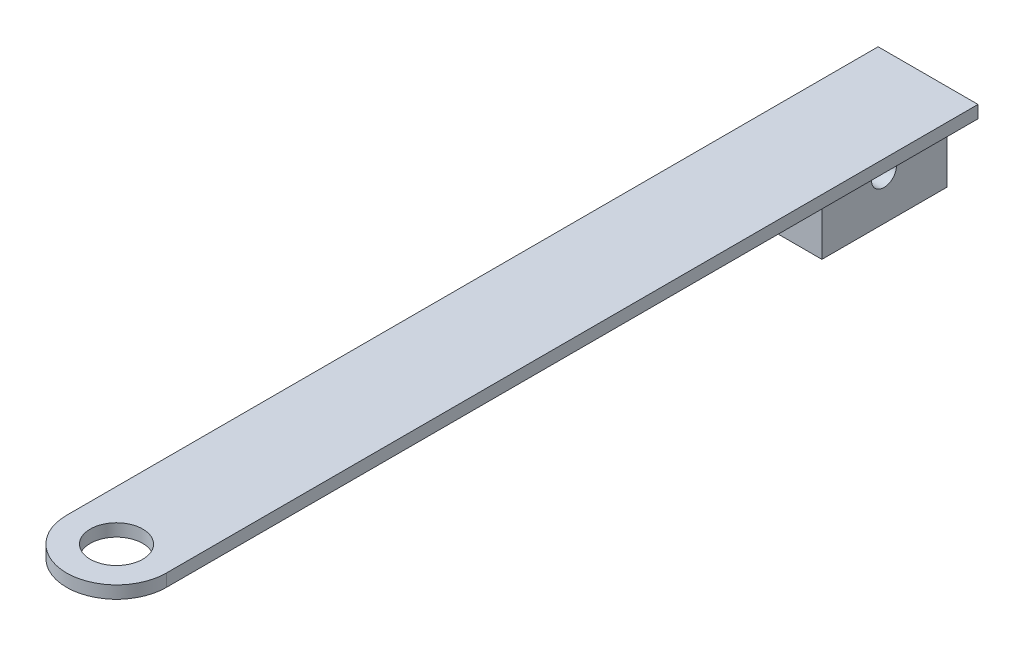
ISO-10303-21;
HEADER;
FILE_DESCRIPTION(('STEP AP214'),'2;1');
FILE_NAME('part.step','',(''),(''),'','','');
FILE_SCHEMA(('AUTOMOTIVE_DESIGN { 1 0 10303 214 1 1 1 1 }'));
ENDSEC;
DATA;
#1=APPLICATION_CONTEXT('core data for automotive mechanical design processes');
#2=APPLICATION_PROTOCOL_DEFINITION('international standard','automotive_design',2000,#1);
#3=PRODUCT_CONTEXT('',#1,'mechanical');
#4=PRODUCT('Part','Part','',(#3));
#5=PRODUCT_RELATED_PRODUCT_CATEGORY('part','',(#4));
#6=PRODUCT_DEFINITION_FORMATION('','',#4);
#7=PRODUCT_DEFINITION_CONTEXT('part definition',#1,'design');
#8=PRODUCT_DEFINITION('design','',#6,#7);
#9=PRODUCT_DEFINITION_SHAPE('','',#8);
#10=(LENGTH_UNIT() NAMED_UNIT(*) SI_UNIT(.MILLI.,.METRE.));
#11=(NAMED_UNIT(*) PLANE_ANGLE_UNIT() SI_UNIT($,.RADIAN.));
#12=(NAMED_UNIT(*) SI_UNIT($,.STERADIAN.) SOLID_ANGLE_UNIT());
#13=UNCERTAINTY_MEASURE_WITH_UNIT(LENGTH_MEASURE(1.E-05),#10,'distance_accuracy_value','');
#14=(GEOMETRIC_REPRESENTATION_CONTEXT(3) GLOBAL_UNCERTAINTY_ASSIGNED_CONTEXT((#13)) GLOBAL_UNIT_ASSIGNED_CONTEXT((#10,
#11,#12)) REPRESENTATION_CONTEXT('',''));
#15=CARTESIAN_POINT('',(0.,0.,0.));
#16=DIRECTION('',(0.,0.,1.));
#17=DIRECTION('',(1.,0.,0.));
#18=AXIS2_PLACEMENT_3D('',#15,#16,#17);
#19=CARTESIAN_POINT('',(0.,0.,0.));
#20=DIRECTION('',(0.,1.,0.));
#21=DIRECTION('',(0.,0.,1.));
#22=AXIS2_PLACEMENT_3D('',#19,#20,#21);
#23=PLANE('',#22);
#24=CARTESIAN_POINT('',(0.,0.,0.));
#25=DIRECTION('',(0.,1.,0.));
#26=DIRECTION('',(0.,0.,1.));
#27=AXIS2_PLACEMENT_3D('',#24,#25,#26);
#28=CIRCLE('',#27,2.667);
#29=CARTESIAN_POINT('',(0.,0.,2.667));
#30=VERTEX_POINT('',#29);
#31=EDGE_CURVE('E159',#30,#30,#28,.T.);
#32=ORIENTED_EDGE('',*,*,#31,.T.);
#33=EDGE_LOOP('',(#32));
#34=FACE_BOUND('',#33,.T.);
#35=DIRECTION('',(-1.,0.,0.));
#36=VECTOR('',#35,1.);
#37=CARTESIAN_POINT('',(-5.07999999999999,0.,-69.85));
#38=LINE('',#37,#36);
#39=CARTESIAN_POINT('',(1.905,0.,-69.85));
#40=VERTEX_POINT('',#39);
#41=CARTESIAN_POINT('',(-5.07999999999999,0.,-69.85));
#42=VERTEX_POINT('',#41);
#43=EDGE_CURVE('E122',#40,#42,#38,.T.);
#44=ORIENTED_EDGE('',*,*,#43,.F.);
#45=DIRECTION('',(0.,0.,1.));
#46=VECTOR('',#45,1.);
#47=CARTESIAN_POINT('',(1.905,0.,-82.55));
#48=LINE('',#47,#46);
#49=CARTESIAN_POINT('',(1.905,0.,-82.55));
#50=VERTEX_POINT('',#49);
#51=EDGE_CURVE('E52',#50,#40,#48,.T.);
#52=ORIENTED_EDGE('',*,*,#51,.F.);
#53=DIRECTION('',(1.,0.,0.));
#54=VECTOR('',#53,1.);
#55=CARTESIAN_POINT('',(5.08,0.,-82.55));
#56=LINE('',#55,#54);
#57=CARTESIAN_POINT('',(5.08,0.,-82.55));
#58=VERTEX_POINT('',#57);
#59=EDGE_CURVE('E142',#50,#58,#56,.T.);
#60=ORIENTED_EDGE('',*,*,#59,.T.);
#61=DIRECTION('',(0.,0.,1.));
#62=VECTOR('',#61,1.);
#63=CARTESIAN_POINT('',(5.08,0.,0.));
#64=LINE('',#63,#62);
#65=CARTESIAN_POINT('',(5.08,0.,0.));
#66=VERTEX_POINT('',#65);
#67=EDGE_CURVE('E139',#58,#66,#64,.T.);
#68=ORIENTED_EDGE('',*,*,#67,.T.);
#69=CARTESIAN_POINT('',(0.,0.,0.));
#70=DIRECTION('',(0.,1.,0.));
#71=DIRECTION('',(0.,0.,1.));
#72=AXIS2_PLACEMENT_3D('',#69,#70,#71);
#73=CIRCLE('',#72,5.08);
#74=CARTESIAN_POINT('',(-5.08,0.,0.));
#75=VERTEX_POINT('',#74);
#76=EDGE_CURVE('E39',#75,#66,#73,.T.);
#77=ORIENTED_EDGE('',*,*,#76,.F.);
#78=DIRECTION('',(0.,0.,-1.));
#79=VECTOR('',#78,1.);
#80=CARTESIAN_POINT('',(-5.07999999999999,0.,-82.55));
#81=LINE('',#80,#79);
#82=EDGE_CURVE('E58',#75,#42,#81,.T.);
#83=ORIENTED_EDGE('',*,*,#82,.T.);
#84=EDGE_LOOP('',(#44,#52,#60,#68,#77,#83));
#85=FACE_BOUND('',#84,.T.);
#86=ADVANCED_FACE('F35',(#34,#85),#23,.F.);
#87=CARTESIAN_POINT('',(0.,1.27,0.));
#88=DIRECTION('',(0.,-1.,0.));
#89=DIRECTION('',(0.,0.,-1.));
#90=AXIS2_PLACEMENT_3D('',#87,#88,#89);
#91=CYLINDRICAL_SURFACE('',#90,2.667);
#92=CARTESIAN_POINT('',(0.,1.27,0.));
#93=DIRECTION('',(0.,1.,0.));
#94=DIRECTION('',(0.,0.,1.));
#95=AXIS2_PLACEMENT_3D('',#92,#93,#94);
#96=CIRCLE('',#95,2.667);
#97=CARTESIAN_POINT('',(0.,1.27,2.667));
#98=VERTEX_POINT('',#97);
#99=EDGE_CURVE('E44',#98,#98,#96,.T.);
#100=ORIENTED_EDGE('',*,*,#99,.T.);
#101=EDGE_LOOP('',(#100));
#102=FACE_BOUND('',#101,.T.);
#103=ORIENTED_EDGE('',*,*,#31,.F.);
#104=EDGE_LOOP('',(#103));
#105=FACE_BOUND('',#104,.T.);
#106=ADVANCED_FACE('F37',(#102,#105),#91,.F.);
#107=CARTESIAN_POINT('',(0.,1.27,0.));
#108=DIRECTION('',(0.,-1.,0.));
#109=DIRECTION('',(0.,0.,-1.));
#110=AXIS2_PLACEMENT_3D('',#107,#108,#109);
#111=CYLINDRICAL_SURFACE('',#110,5.08);
#112=CARTESIAN_POINT('',(0.,1.27,0.));
#113=DIRECTION('',(0.,1.,0.));
#114=DIRECTION('',(0.,0.,1.));
#115=AXIS2_PLACEMENT_3D('',#112,#113,#114);
#116=CIRCLE('',#115,5.08);
#117=CARTESIAN_POINT('',(-5.08,1.27,0.));
#118=VERTEX_POINT('',#117);
#119=CARTESIAN_POINT('',(5.08,1.27,0.));
#120=VERTEX_POINT('',#119);
#121=EDGE_CURVE('E11',#118,#120,#116,.T.);
#122=ORIENTED_EDGE('',*,*,#121,.F.);
#123=DIRECTION('',(0.,-1.,0.));
#124=VECTOR('',#123,1.);
#125=CARTESIAN_POINT('',(-5.08,84.4428807965673,0.));
#126=LINE('',#125,#124);
#127=EDGE_CURVE('E154',#118,#75,#126,.T.);
#128=ORIENTED_EDGE('',*,*,#127,.T.);
#129=ORIENTED_EDGE('',*,*,#76,.T.);
#130=DIRECTION('',(0.,-1.,0.));
#131=VECTOR('',#130,1.);
#132=CARTESIAN_POINT('',(5.08,84.4428807965673,0.));
#133=LINE('',#132,#131);
#134=EDGE_CURVE('E149',#120,#66,#133,.T.);
#135=ORIENTED_EDGE('',*,*,#134,.F.);
#136=EDGE_LOOP('',(#122,#128,#129,#135));
#137=FACE_BOUND('',#136,.T.);
#138=ADVANCED_FACE('F165',(#137),#111,.T.);
#139=CARTESIAN_POINT('',(0.,1.27,0.));
#140=DIRECTION('',(0.,1.,0.));
#141=DIRECTION('',(0.,0.,1.));
#142=AXIS2_PLACEMENT_3D('',#139,#140,#141);
#143=PLANE('',#142);
#144=ORIENTED_EDGE('',*,*,#99,.F.);
#145=EDGE_LOOP('',(#144));
#146=FACE_BOUND('',#145,.T.);
#147=ORIENTED_EDGE('',*,*,#121,.T.);
#148=DIRECTION('',(0.,0.,1.));
#149=VECTOR('',#148,1.);
#150=CARTESIAN_POINT('',(5.08,1.26999999999999,0.));
#151=LINE('',#150,#149);
#152=CARTESIAN_POINT('',(5.08,1.26999999999999,-82.55));
#153=VERTEX_POINT('',#152);
#154=EDGE_CURVE('E146',#153,#120,#151,.T.);
#155=ORIENTED_EDGE('',*,*,#154,.F.);
#156=DIRECTION('',(1.,0.,0.));
#157=VECTOR('',#156,1.);
#158=CARTESIAN_POINT('',(5.08,1.26999999999999,-82.55));
#159=LINE('',#158,#157);
#160=CARTESIAN_POINT('',(-5.07999999999999,1.26999999999999,-82.55));
#161=VERTEX_POINT('',#160);
#162=EDGE_CURVE('E107',#161,#153,#159,.T.);
#163=ORIENTED_EDGE('',*,*,#162,.F.);
#164=DIRECTION('',(0.,0.,-1.));
#165=VECTOR('',#164,1.);
#166=CARTESIAN_POINT('',(-5.07999999999999,1.26999999999999,-82.55));
#167=LINE('',#166,#165);
#168=EDGE_CURVE('E104',#118,#161,#167,.T.);
#169=ORIENTED_EDGE('',*,*,#168,.F.);
#170=EDGE_LOOP('',(#147,#155,#163,#169));
#171=FACE_BOUND('',#170,.T.);
#172=ADVANCED_FACE('F171',(#146,#171),#143,.T.);
#173=CARTESIAN_POINT('',(-5.07999999999999,84.4428807965673,-82.55));
#174=DIRECTION('',(-1.,0.,0.));
#175=DIRECTION('',(0.,0.,1.));
#176=AXIS2_PLACEMENT_3D('',#173,#174,#175);
#177=PLANE('',#176);
#178=CARTESIAN_POINT('',(-5.07999999999999,-3.17500000000001,-76.1576549008699));
#179=DIRECTION('',(-1.,0.,0.));
#180=DIRECTION('',(0.,0.,1.));
#181=AXIS2_PLACEMENT_3D('',#178,#179,#180);
#182=CIRCLE('',#181,1.27);
#183=CARTESIAN_POINT('',(-5.07999999999999,-3.17500000000001,-74.8876549008699));
#184=VERTEX_POINT('',#183);
#185=EDGE_CURVE('E126',#184,#184,#182,.F.);
#186=ORIENTED_EDGE('',*,*,#185,.T.);
#187=EDGE_LOOP('',(#186));
#188=FACE_BOUND('',#187,.T.);
#189=ORIENTED_EDGE('',*,*,#127,.F.);
#190=ORIENTED_EDGE('',*,*,#168,.T.);
#191=DIRECTION('',(0.,-1.,0.));
#192=VECTOR('',#191,1.);
#193=CARTESIAN_POINT('',(-5.07999999999999,84.4428807965673,-82.55));
#194=LINE('',#193,#192);
#195=CARTESIAN_POINT('',(-5.07999999999999,-7.62,-82.55));
#196=VERTEX_POINT('',#195);
#197=EDGE_CURVE('E96',#161,#196,#194,.T.);
#198=ORIENTED_EDGE('',*,*,#197,.T.);
#199=DIRECTION('',(0.,0.,-1.));
#200=VECTOR('',#199,1.);
#201=CARTESIAN_POINT('',(-5.07999999999999,-7.62,-82.55));
#202=LINE('',#201,#200);
#203=CARTESIAN_POINT('',(-5.07999999999999,-7.62,-69.85));
#204=VERTEX_POINT('',#203);
#205=EDGE_CURVE('E102',#204,#196,#202,.T.);
#206=ORIENTED_EDGE('',*,*,#205,.F.);
#207=DIRECTION('',(0.,1.,0.));
#208=VECTOR('',#207,1.);
#209=CARTESIAN_POINT('',(-5.07999999999999,-7.62,-69.85));
#210=LINE('',#209,#208);
#211=EDGE_CURVE('E131',#204,#42,#210,.T.);
#212=ORIENTED_EDGE('',*,*,#211,.T.);
#213=ORIENTED_EDGE('',*,*,#82,.F.);
#214=EDGE_LOOP('',(#189,#190,#198,#206,#212,#213));
#215=FACE_BOUND('',#214,.T.);
#216=ADVANCED_FACE('F99',(#188,#215),#177,.T.);
#217=CARTESIAN_POINT('',(5.08,84.4428807965673,-82.55));
#218=DIRECTION('',(0.,0.,-1.));
#219=DIRECTION('',(-1.,0.,0.));
#220=AXIS2_PLACEMENT_3D('',#217,#218,#219);
#221=PLANE('',#220);
#222=ORIENTED_EDGE('',*,*,#197,.F.);
#223=ORIENTED_EDGE('',*,*,#162,.T.);
#224=DIRECTION('',(0.,-1.,0.));
#225=VECTOR('',#224,1.);
#226=CARTESIAN_POINT('',(5.08,84.4428807965673,-82.55));
#227=LINE('',#226,#225);
#228=EDGE_CURVE('E150',#153,#58,#227,.T.);
#229=ORIENTED_EDGE('',*,*,#228,.T.);
#230=ORIENTED_EDGE('',*,*,#59,.F.);
#231=DIRECTION('',(0.,1.,0.));
#232=VECTOR('',#231,1.);
#233=CARTESIAN_POINT('',(1.905,-7.62,-82.55));
#234=LINE('',#233,#232);
#235=CARTESIAN_POINT('',(1.905,-7.62,-82.55));
#236=VERTEX_POINT('',#235);
#237=EDGE_CURVE('E113',#236,#50,#234,.T.);
#238=ORIENTED_EDGE('',*,*,#237,.F.);
#239=DIRECTION('',(1.,0.,0.));
#240=VECTOR('',#239,1.);
#241=CARTESIAN_POINT('',(-5.07999999999999,-7.62,-82.55));
#242=LINE('',#241,#240);
#243=EDGE_CURVE('E110',#196,#236,#242,.T.);
#244=ORIENTED_EDGE('',*,*,#243,.F.);
#245=EDGE_LOOP('',(#222,#223,#229,#230,#238,#244));
#246=FACE_BOUND('',#245,.T.);
#247=ADVANCED_FACE('F111',(#246),#221,.T.);
#248=CARTESIAN_POINT('',(5.08,84.4428807965673,0.));
#249=DIRECTION('',(1.,0.,0.));
#250=DIRECTION('',(0.,0.,-1.));
#251=AXIS2_PLACEMENT_3D('',#248,#249,#250);
#252=PLANE('',#251);
#253=ORIENTED_EDGE('',*,*,#228,.F.);
#254=ORIENTED_EDGE('',*,*,#154,.T.);
#255=ORIENTED_EDGE('',*,*,#134,.T.);
#256=ORIENTED_EDGE('',*,*,#67,.F.);
#257=EDGE_LOOP('',(#253,#254,#255,#256));
#258=FACE_BOUND('',#257,.T.);
#259=ADVANCED_FACE('F169',(#258),#252,.T.);
#260=CARTESIAN_POINT('',(1.905,-7.62,-82.55));
#261=DIRECTION('',(-1.,0.,0.));
#262=DIRECTION('',(0.,0.,1.));
#263=AXIS2_PLACEMENT_3D('',#260,#261,#262);
#264=PLANE('',#263);
#265=CARTESIAN_POINT('',(1.905,-3.17500000000001,-76.1576549008699));
#266=DIRECTION('',(1.,0.,0.));
#267=DIRECTION('',(0.,0.,-1.));
#268=AXIS2_PLACEMENT_3D('',#265,#266,#267);
#269=CIRCLE('',#268,1.27);
#270=CARTESIAN_POINT('',(1.905,-3.17500000000001,-77.42765490087));
#271=VERTEX_POINT('',#270);
#272=EDGE_CURVE('E132',#271,#271,#269,.T.);
#273=ORIENTED_EDGE('',*,*,#272,.F.);
#274=EDGE_LOOP('',(#273));
#275=FACE_BOUND('',#274,.T.);
#276=ORIENTED_EDGE('',*,*,#51,.T.);
#277=DIRECTION('',(0.,1.,0.));
#278=VECTOR('',#277,1.);
#279=CARTESIAN_POINT('',(1.905,-7.62,-69.85));
#280=LINE('',#279,#278);
#281=CARTESIAN_POINT('',(1.905,-7.62,-69.85));
#282=VERTEX_POINT('',#281);
#283=EDGE_CURVE('E135',#282,#40,#280,.T.);
#284=ORIENTED_EDGE('',*,*,#283,.F.);
#285=DIRECTION('',(0.,0.,1.));
#286=VECTOR('',#285,1.);
#287=CARTESIAN_POINT('',(1.905,-7.62,-82.55));
#288=LINE('',#287,#286);
#289=EDGE_CURVE('E116',#236,#282,#288,.T.);
#290=ORIENTED_EDGE('',*,*,#289,.F.);
#291=ORIENTED_EDGE('',*,*,#237,.T.);
#292=EDGE_LOOP('',(#276,#284,#290,#291));
#293=FACE_BOUND('',#292,.T.);
#294=ADVANCED_FACE('F176',(#275,#293),#264,.F.);
#295=CARTESIAN_POINT('',(-5.07999999999999,-7.62,-69.85));
#296=DIRECTION('',(0.,0.,-1.));
#297=DIRECTION('',(-1.,0.,0.));
#298=AXIS2_PLACEMENT_3D('',#295,#296,#297);
#299=PLANE('',#298);
#300=ORIENTED_EDGE('',*,*,#43,.T.);
#301=ORIENTED_EDGE('',*,*,#211,.F.);
#302=DIRECTION('',(-1.,0.,0.));
#303=VECTOR('',#302,1.);
#304=CARTESIAN_POINT('',(-5.07999999999999,-7.62,-69.85));
#305=LINE('',#304,#303);
#306=EDGE_CURVE('E120',#282,#204,#305,.T.);
#307=ORIENTED_EDGE('',*,*,#306,.F.);
#308=ORIENTED_EDGE('',*,*,#283,.T.);
#309=EDGE_LOOP('',(#300,#301,#307,#308));
#310=FACE_BOUND('',#309,.T.);
#311=ADVANCED_FACE('F173',(#310),#299,.F.);
#312=CARTESIAN_POINT('',(0.,-7.62,0.));
#313=DIRECTION('',(0.,1.,0.));
#314=DIRECTION('',(0.,0.,1.));
#315=AXIS2_PLACEMENT_3D('',#312,#313,#314);
#316=PLANE('',#315);
#317=ORIENTED_EDGE('',*,*,#205,.T.);
#318=ORIENTED_EDGE('',*,*,#243,.T.);
#319=ORIENTED_EDGE('',*,*,#289,.T.);
#320=ORIENTED_EDGE('',*,*,#306,.T.);
#321=EDGE_LOOP('',(#317,#318,#319,#320));
#322=FACE_BOUND('',#321,.T.);
#323=ADVANCED_FACE('F118',(#322),#316,.F.);
#324=CARTESIAN_POINT('',(-5.081,-3.17500000000001,-76.1576549008699));
#325=DIRECTION('',(1.,0.,0.));
#326=DIRECTION('',(0.,0.,-1.));
#327=AXIS2_PLACEMENT_3D('',#324,#325,#326);
#328=CYLINDRICAL_SURFACE('',#327,1.27);
#329=ORIENTED_EDGE('',*,*,#185,.F.);
#330=EDGE_LOOP('',(#329));
#331=FACE_BOUND('',#330,.T.);
#332=ORIENTED_EDGE('',*,*,#272,.T.);
#333=EDGE_LOOP('',(#332));
#334=FACE_BOUND('',#333,.T.);
#335=ADVANCED_FACE('F216',(#331,#334),#328,.F.);
#336=CLOSED_SHELL('',(#86,#106,#138,#172,#216,#247,#259,#294,#311,#323,#335));
#337=MANIFOLD_SOLID_BREP('B2',#336);
#338=ADVANCED_BREP_SHAPE_REPRESENTATION('',(#18,#337),#14);
#339=SHAPE_DEFINITION_REPRESENTATION(#9,#338);
ENDSEC;
END-ISO-10303-21;
